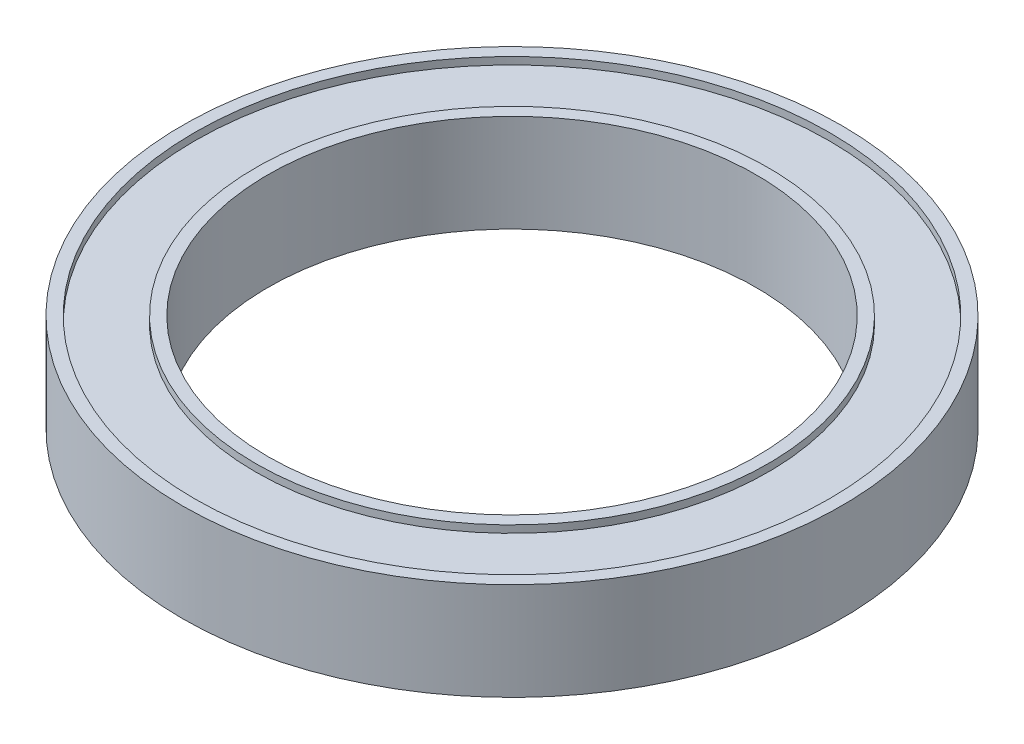
ISO-10303-21;
HEADER;
FILE_DESCRIPTION(('STEP AP214'),'2;1');
FILE_NAME('part.step','',(''),(''),'','','');
FILE_SCHEMA(('AUTOMOTIVE_DESIGN { 1 0 10303 214 1 1 1 1 }'));
ENDSEC;
DATA;
#1=APPLICATION_CONTEXT('core data for automotive mechanical design processes');
#2=APPLICATION_PROTOCOL_DEFINITION('international standard','automotive_design',2000,#1);
#3=PRODUCT_CONTEXT('',#1,'mechanical');
#4=PRODUCT('Part','Part','',(#3));
#5=PRODUCT_RELATED_PRODUCT_CATEGORY('part','',(#4));
#6=PRODUCT_DEFINITION_FORMATION('','',#4);
#7=PRODUCT_DEFINITION_CONTEXT('part definition',#1,'design');
#8=PRODUCT_DEFINITION('design','',#6,#7);
#9=PRODUCT_DEFINITION_SHAPE('','',#8);
#10=(LENGTH_UNIT() NAMED_UNIT(*) SI_UNIT(.MILLI.,.METRE.));
#11=(NAMED_UNIT(*) PLANE_ANGLE_UNIT() SI_UNIT($,.RADIAN.));
#12=(NAMED_UNIT(*) SI_UNIT($,.STERADIAN.) SOLID_ANGLE_UNIT());
#13=UNCERTAINTY_MEASURE_WITH_UNIT(LENGTH_MEASURE(1.E-05),#10,'distance_accuracy_value','');
#14=(GEOMETRIC_REPRESENTATION_CONTEXT(3) GLOBAL_UNCERTAINTY_ASSIGNED_CONTEXT((#13)) GLOBAL_UNIT_ASSIGNED_CONTEXT((#10,
#11,#12)) REPRESENTATION_CONTEXT('',''));
#15=CARTESIAN_POINT('',(0.,0.,0.));
#16=DIRECTION('',(0.,0.,1.));
#17=DIRECTION('',(1.,0.,0.));
#18=AXIS2_PLACEMENT_3D('',#15,#16,#17);
#19=CARTESIAN_POINT('',(0.,0.,0.));
#20=DIRECTION('',(0.,1.,0.));
#21=DIRECTION('',(0.,0.,1.));
#22=AXIS2_PLACEMENT_3D('',#19,#20,#21);
#23=PLANE('',#22);
#24=CARTESIAN_POINT('',(0.,0.,0.));
#25=DIRECTION('',(0.,1.,0.));
#26=DIRECTION('',(0.,0.,1.));
#27=AXIS2_PLACEMENT_3D('',#24,#25,#26);
#28=CIRCLE('',#27,10.);
#29=CARTESIAN_POINT('',(0.,0.,10.));
#30=VERTEX_POINT('',#29);
#31=EDGE_CURVE('E55',#30,#30,#28,.T.);
#32=ORIENTED_EDGE('',*,*,#31,.T.);
#33=EDGE_LOOP('',(#32));
#34=FACE_BOUND('',#33,.T.);
#35=CARTESIAN_POINT('',(0.,0.,0.));
#36=DIRECTION('',(0.,1.,0.));
#37=DIRECTION('',(0.,0.,1.));
#38=AXIS2_PLACEMENT_3D('',#35,#36,#37);
#39=CIRCLE('',#38,10.5);
#40=CARTESIAN_POINT('',(0.,0.,10.5));
#41=VERTEX_POINT('',#40);
#42=EDGE_CURVE('E87',#41,#41,#39,.T.);
#43=ORIENTED_EDGE('',*,*,#42,.F.);
#44=EDGE_LOOP('',(#43));
#45=FACE_BOUND('',#44,.T.);
#46=ADVANCED_FACE('F40',(#34,#45),#23,.F.);
#47=CARTESIAN_POINT('',(0.,4.,0.));
#48=DIRECTION('',(0.,1.,0.));
#49=DIRECTION('',(0.,0.,1.));
#50=AXIS2_PLACEMENT_3D('',#47,#48,#49);
#51=PLANE('',#50);
#52=CARTESIAN_POINT('',(0.,4.,0.));
#53=DIRECTION('',(0.,1.,0.));
#54=DIRECTION('',(0.,0.,1.));
#55=AXIS2_PLACEMENT_3D('',#52,#53,#54);
#56=CIRCLE('',#55,10.);
#57=CARTESIAN_POINT('',(0.,4.,10.));
#58=VERTEX_POINT('',#57);
#59=EDGE_CURVE('E53',#58,#58,#56,.T.);
#60=ORIENTED_EDGE('',*,*,#59,.F.);
#61=EDGE_LOOP('',(#60));
#62=FACE_BOUND('',#61,.T.);
#63=CARTESIAN_POINT('',(0.,4.,0.));
#64=DIRECTION('',(0.,1.,0.));
#65=DIRECTION('',(0.,0.,1.));
#66=AXIS2_PLACEMENT_3D('',#63,#64,#65);
#67=CIRCLE('',#66,10.5);
#68=CARTESIAN_POINT('',(0.,4.,10.5));
#69=VERTEX_POINT('',#68);
#70=EDGE_CURVE('E71',#69,#69,#67,.T.);
#71=ORIENTED_EDGE('',*,*,#70,.T.);
#72=EDGE_LOOP('',(#71));
#73=FACE_BOUND('',#72,.T.);
#74=ADVANCED_FACE('F105',(#62,#73),#51,.T.);
#75=CARTESIAN_POINT('',(0.,4.,0.));
#76=DIRECTION('',(0.,1.,0.));
#77=DIRECTION('',(0.,0.,1.));
#78=AXIS2_PLACEMENT_3D('',#75,#76,#77);
#79=CIRCLE('',#78,13.);
#80=CARTESIAN_POINT('',(0.,4.,13.));
#81=VERTEX_POINT('',#80);
#82=EDGE_CURVE('E63',#81,#81,#79,.T.);
#83=ORIENTED_EDGE('',*,*,#82,.F.);
#84=EDGE_LOOP('',(#83));
#85=FACE_BOUND('',#84,.T.);
#86=CARTESIAN_POINT('',(0.,4.,0.));
#87=DIRECTION('',(0.,1.,0.));
#88=DIRECTION('',(0.,0.,1.));
#89=AXIS2_PLACEMENT_3D('',#86,#87,#88);
#90=CIRCLE('',#89,13.5);
#91=CARTESIAN_POINT('',(0.,4.,13.5));
#92=VERTEX_POINT('',#91);
#93=EDGE_CURVE('E10',#92,#92,#90,.T.);
#94=ORIENTED_EDGE('',*,*,#93,.T.);
#95=EDGE_LOOP('',(#94));
#96=FACE_BOUND('',#95,.T.);
#97=ADVANCED_FACE('F111',(#85,#96),#51,.T.);
#98=CARTESIAN_POINT('',(0.,0.,0.));
#99=DIRECTION('',(0.,1.,0.));
#100=DIRECTION('',(0.,0.,1.));
#101=AXIS2_PLACEMENT_3D('',#98,#99,#100);
#102=CIRCLE('',#101,13.);
#103=CARTESIAN_POINT('',(0.,0.,13.));
#104=VERTEX_POINT('',#103);
#105=EDGE_CURVE('E79',#104,#104,#102,.T.);
#106=ORIENTED_EDGE('',*,*,#105,.T.);
#107=EDGE_LOOP('',(#106));
#108=FACE_BOUND('',#107,.T.);
#109=CARTESIAN_POINT('',(0.,0.,0.));
#110=DIRECTION('',(0.,1.,0.));
#111=DIRECTION('',(0.,0.,1.));
#112=AXIS2_PLACEMENT_3D('',#109,#110,#111);
#113=CIRCLE('',#112,13.5);
#114=CARTESIAN_POINT('',(0.,0.,13.5));
#115=VERTEX_POINT('',#114);
#116=EDGE_CURVE('E44',#115,#115,#113,.T.);
#117=ORIENTED_EDGE('',*,*,#116,.F.);
#118=EDGE_LOOP('',(#117));
#119=FACE_BOUND('',#118,.T.);
#120=ADVANCED_FACE('F107',(#108,#119),#23,.F.);
#121=CARTESIAN_POINT('',(0.,4.,0.));
#122=DIRECTION('',(0.,-1.,0.));
#123=DIRECTION('',(0.,0.,-1.));
#124=AXIS2_PLACEMENT_3D('',#121,#122,#123);
#125=CYLINDRICAL_SURFACE('',#124,13.5);
#126=ORIENTED_EDGE('',*,*,#93,.F.);
#127=EDGE_LOOP('',(#126));
#128=FACE_BOUND('',#127,.T.);
#129=ORIENTED_EDGE('',*,*,#116,.T.);
#130=EDGE_LOOP('',(#129));
#131=FACE_BOUND('',#130,.T.);
#132=ADVANCED_FACE('F42',(#128,#131),#125,.T.);
#133=CARTESIAN_POINT('',(0.,4.,0.));
#134=DIRECTION('',(0.,-1.,0.));
#135=DIRECTION('',(0.,0.,-1.));
#136=AXIS2_PLACEMENT_3D('',#133,#134,#135);
#137=CYLINDRICAL_SURFACE('',#136,10.);
#138=ORIENTED_EDGE('',*,*,#59,.T.);
#139=EDGE_LOOP('',(#138));
#140=FACE_BOUND('',#139,.T.);
#141=ORIENTED_EDGE('',*,*,#31,.F.);
#142=EDGE_LOOP('',(#141));
#143=FACE_BOUND('',#142,.T.);
#144=ADVANCED_FACE('F120',(#140,#143),#137,.F.);
#145=CARTESIAN_POINT('',(0.,3.7,0.));
#146=DIRECTION('',(0.,1.,0.));
#147=DIRECTION('',(0.,0.,1.));
#148=AXIS2_PLACEMENT_3D('',#145,#146,#147);
#149=CYLINDRICAL_SURFACE('',#148,13.);
#150=CARTESIAN_POINT('',(0.,3.7,0.));
#151=DIRECTION('',(0.,1.,0.));
#152=DIRECTION('',(0.,0.,1.));
#153=AXIS2_PLACEMENT_3D('',#150,#151,#152);
#154=CIRCLE('',#153,13.);
#155=CARTESIAN_POINT('',(0.,3.7,13.));
#156=VERTEX_POINT('',#155);
#157=EDGE_CURVE('E59',#156,#156,#154,.T.);
#158=ORIENTED_EDGE('',*,*,#157,.F.);
#159=EDGE_LOOP('',(#158));
#160=FACE_BOUND('',#159,.T.);
#161=ORIENTED_EDGE('',*,*,#82,.T.);
#162=EDGE_LOOP('',(#161));
#163=FACE_BOUND('',#162,.T.);
#164=ADVANCED_FACE('F144',(#160,#163),#149,.F.);
#165=CARTESIAN_POINT('',(0.,3.7,0.));
#166=DIRECTION('',(0.,1.,0.));
#167=DIRECTION('',(0.,0.,1.));
#168=AXIS2_PLACEMENT_3D('',#165,#166,#167);
#169=PLANE('',#168);
#170=CARTESIAN_POINT('',(0.,3.7,0.));
#171=DIRECTION('',(0.,1.,0.));
#172=DIRECTION('',(0.,0.,1.));
#173=AXIS2_PLACEMENT_3D('',#170,#171,#172);
#174=CIRCLE('',#173,10.5);
#175=CARTESIAN_POINT('',(0.,3.7,10.5));
#176=VERTEX_POINT('',#175);
#177=EDGE_CURVE('E67',#176,#176,#174,.T.);
#178=ORIENTED_EDGE('',*,*,#177,.F.);
#179=EDGE_LOOP('',(#178));
#180=FACE_BOUND('',#179,.T.);
#181=ORIENTED_EDGE('',*,*,#157,.T.);
#182=EDGE_LOOP('',(#181));
#183=FACE_BOUND('',#182,.T.);
#184=ADVANCED_FACE('F140',(#180,#183),#169,.T.);
#185=CARTESIAN_POINT('',(0.,3.7,0.));
#186=DIRECTION('',(0.,1.,0.));
#187=DIRECTION('',(0.,0.,1.));
#188=AXIS2_PLACEMENT_3D('',#185,#186,#187);
#189=CYLINDRICAL_SURFACE('',#188,10.5);
#190=ORIENTED_EDGE('',*,*,#177,.T.);
#191=EDGE_LOOP('',(#190));
#192=FACE_BOUND('',#191,.T.);
#193=ORIENTED_EDGE('',*,*,#70,.F.);
#194=EDGE_LOOP('',(#193));
#195=FACE_BOUND('',#194,.T.);
#196=ADVANCED_FACE('F134',(#192,#195),#189,.T.);
#197=CARTESIAN_POINT('',(0.,0.3,0.));
#198=DIRECTION('',(0.,-1.,0.));
#199=DIRECTION('',(0.,0.,1.));
#200=AXIS2_PLACEMENT_3D('',#197,#198,#199);
#201=PLANE('',#200);
#202=CARTESIAN_POINT('',(0.,0.3,0.));
#203=DIRECTION('',(0.,1.,0.));
#204=DIRECTION('',(0.,0.,1.));
#205=AXIS2_PLACEMENT_3D('',#202,#203,#204);
#206=CIRCLE('',#205,13.);
#207=CARTESIAN_POINT('',(0.,0.3,13.));
#208=VERTEX_POINT('',#207);
#209=EDGE_CURVE('E75',#208,#208,#206,.T.);
#210=ORIENTED_EDGE('',*,*,#209,.F.);
#211=EDGE_LOOP('',(#210));
#212=FACE_BOUND('',#211,.T.);
#213=CARTESIAN_POINT('',(0.,0.3,0.));
#214=DIRECTION('',(0.,1.,0.));
#215=DIRECTION('',(0.,0.,1.));
#216=AXIS2_PLACEMENT_3D('',#213,#214,#215);
#217=CIRCLE('',#216,10.5);
#218=CARTESIAN_POINT('',(0.,0.3,10.5));
#219=VERTEX_POINT('',#218);
#220=EDGE_CURVE('E83',#219,#219,#217,.T.);
#221=ORIENTED_EDGE('',*,*,#220,.T.);
#222=EDGE_LOOP('',(#221));
#223=FACE_BOUND('',#222,.T.);
#224=ADVANCED_FACE('F95',(#212,#223),#201,.T.);
#225=CARTESIAN_POINT('',(0.,0.3,0.));
#226=DIRECTION('',(0.,-1.,0.));
#227=DIRECTION('',(0.,0.,-1.));
#228=AXIS2_PLACEMENT_3D('',#225,#226,#227);
#229=CYLINDRICAL_SURFACE('',#228,13.);
#230=ORIENTED_EDGE('',*,*,#209,.T.);
#231=EDGE_LOOP('',(#230));
#232=FACE_BOUND('',#231,.T.);
#233=ORIENTED_EDGE('',*,*,#105,.F.);
#234=EDGE_LOOP('',(#233));
#235=FACE_BOUND('',#234,.T.);
#236=ADVANCED_FACE('F100',(#232,#235),#229,.F.);
#237=CARTESIAN_POINT('',(0.,0.3,0.));
#238=DIRECTION('',(0.,-1.,0.));
#239=DIRECTION('',(0.,0.,-1.));
#240=AXIS2_PLACEMENT_3D('',#237,#238,#239);
#241=CYLINDRICAL_SURFACE('',#240,10.5);
#242=ORIENTED_EDGE('',*,*,#220,.F.);
#243=EDGE_LOOP('',(#242));
#244=FACE_BOUND('',#243,.T.);
#245=ORIENTED_EDGE('',*,*,#42,.T.);
#246=EDGE_LOOP('',(#245));
#247=FACE_BOUND('',#246,.T.);
#248=ADVANCED_FACE('F97',(#244,#247),#241,.T.);
#249=CLOSED_SHELL('',(#46,#74,#97,#120,#132,#144,#164,#184,#196,#224,#236,#248));
#250=MANIFOLD_SOLID_BREP('B2',#249);
#251=ADVANCED_BREP_SHAPE_REPRESENTATION('',(#18,#250),#14);
#252=SHAPE_DEFINITION_REPRESENTATION(#9,#251);
ENDSEC;
END-ISO-10303-21;
